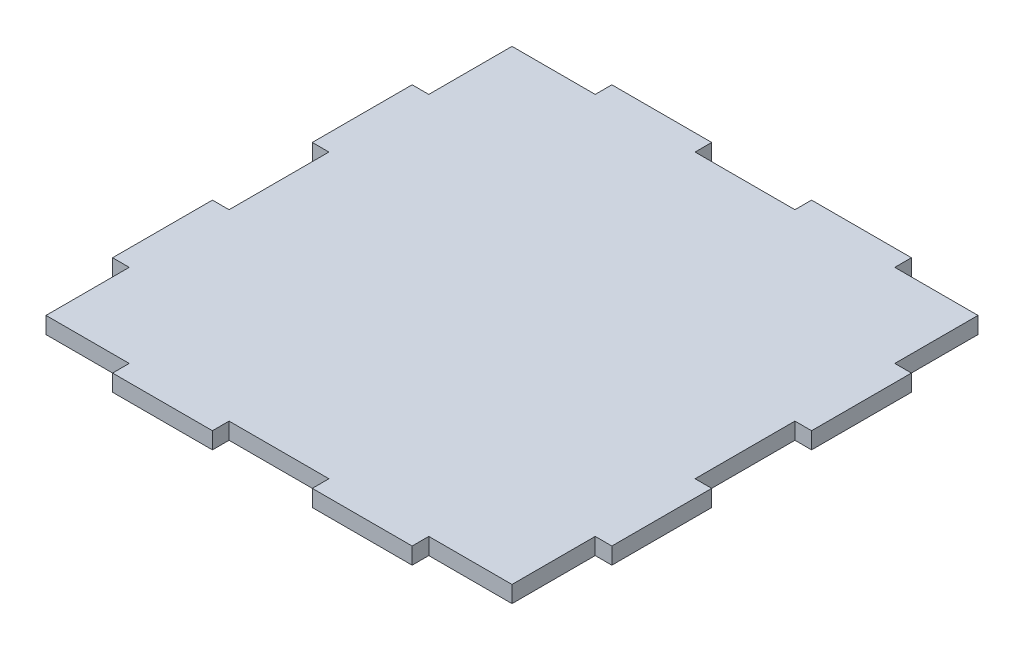
ISO-10303-21;
HEADER;
FILE_DESCRIPTION(('STEP AP214'),'2;1');
FILE_NAME('part.step','',(''),(''),'','','');
FILE_SCHEMA(('AUTOMOTIVE_DESIGN { 1 0 10303 214 1 1 1 1 }'));
ENDSEC;
DATA;
#1=APPLICATION_CONTEXT('core data for automotive mechanical design processes');
#2=APPLICATION_PROTOCOL_DEFINITION('international standard','automotive_design',2000,#1);
#3=PRODUCT_CONTEXT('',#1,'mechanical');
#4=PRODUCT('Part','Part','',(#3));
#5=PRODUCT_RELATED_PRODUCT_CATEGORY('part','',(#4));
#6=PRODUCT_DEFINITION_FORMATION('','',#4);
#7=PRODUCT_DEFINITION_CONTEXT('part definition',#1,'design');
#8=PRODUCT_DEFINITION('design','',#6,#7);
#9=PRODUCT_DEFINITION_SHAPE('','',#8);
#10=(LENGTH_UNIT() NAMED_UNIT(*) SI_UNIT(.MILLI.,.METRE.));
#11=(NAMED_UNIT(*) PLANE_ANGLE_UNIT() SI_UNIT($,.RADIAN.));
#12=(NAMED_UNIT(*) SI_UNIT($,.STERADIAN.) SOLID_ANGLE_UNIT());
#13=UNCERTAINTY_MEASURE_WITH_UNIT(LENGTH_MEASURE(1.E-05),#10,'distance_accuracy_value','');
#14=(GEOMETRIC_REPRESENTATION_CONTEXT(3) GLOBAL_UNCERTAINTY_ASSIGNED_CONTEXT((#13)) GLOBAL_UNIT_ASSIGNED_CONTEXT((#10,
#11,#12)) REPRESENTATION_CONTEXT('',''));
#15=CARTESIAN_POINT('',(0.,0.,0.));
#16=DIRECTION('',(0.,0.,1.));
#17=DIRECTION('',(1.,0.,0.));
#18=AXIS2_PLACEMENT_3D('',#15,#16,#17);
#19=CARTESIAN_POINT('',(-8.99999999999999,3.,0.));
#20=DIRECTION('',(1.,0.,0.));
#21=DIRECTION('',(0.,0.,-1.));
#22=AXIS2_PLACEMENT_3D('',#19,#20,#21);
#23=PLANE('',#22);
#24=DIRECTION('',(0.,0.,1.));
#25=VECTOR('',#24,1.);
#26=CARTESIAN_POINT('',(-8.99999999999999,0.,0.));
#27=LINE('',#26,#25);
#28=CARTESIAN_POINT('',(-8.99999999999999,0.,42.));
#29=VERTEX_POINT('',#28);
#30=CARTESIAN_POINT('',(-8.99999999999999,0.,45.));
#31=VERTEX_POINT('',#30);
#32=EDGE_CURVE('E296',#29,#31,#27,.T.);
#33=ORIENTED_EDGE('',*,*,#32,.F.);
#34=DIRECTION('',(0.,-1.,0.));
#35=VECTOR('',#34,1.);
#36=CARTESIAN_POINT('',(-8.99999999999999,3.,42.));
#37=LINE('',#36,#35);
#38=CARTESIAN_POINT('',(-8.99999999999999,3.,42.));
#39=VERTEX_POINT('',#38);
#40=EDGE_CURVE('E11',#39,#29,#37,.T.);
#41=ORIENTED_EDGE('',*,*,#40,.F.);
#42=DIRECTION('',(0.,0.,1.));
#43=VECTOR('',#42,1.);
#44=CARTESIAN_POINT('',(-8.99999999999999,3.,0.));
#45=LINE('',#44,#43);
#46=CARTESIAN_POINT('',(-8.99999999999999,3.,45.));
#47=VERTEX_POINT('',#46);
#48=EDGE_CURVE('E479',#39,#47,#45,.T.);
#49=ORIENTED_EDGE('',*,*,#48,.T.);
#50=DIRECTION('',(0.,-1.,0.));
#51=VECTOR('',#50,1.);
#52=CARTESIAN_POINT('',(-8.99999999999999,3.,45.));
#53=LINE('',#52,#51);
#54=EDGE_CURVE('E168',#47,#31,#53,.T.);
#55=ORIENTED_EDGE('',*,*,#54,.T.);
#56=EDGE_LOOP('',(#33,#41,#49,#55));
#57=FACE_BOUND('',#56,.T.);
#58=ADVANCED_FACE('F34',(#57),#23,.T.);
#59=CARTESIAN_POINT('',(0.,3.,42.));
#60=DIRECTION('',(0.,0.,1.));
#61=DIRECTION('',(1.,0.,0.));
#62=AXIS2_PLACEMENT_3D('',#59,#60,#61);
#63=PLANE('',#62);
#64=DIRECTION('',(-1.,0.,0.));
#65=VECTOR('',#64,1.);
#66=CARTESIAN_POINT('',(0.,0.,42.));
#67=LINE('',#66,#65);
#68=CARTESIAN_POINT('',(9.00000000000001,0.,42.));
#69=VERTEX_POINT('',#68);
#70=EDGE_CURVE('E299',#69,#29,#67,.T.);
#71=ORIENTED_EDGE('',*,*,#70,.F.);
#72=DIRECTION('',(0.,-1.,0.));
#73=VECTOR('',#72,1.);
#74=CARTESIAN_POINT('',(9.00000000000001,3.,42.));
#75=LINE('',#74,#73);
#76=CARTESIAN_POINT('',(9.00000000000001,3.,42.));
#77=VERTEX_POINT('',#76);
#78=EDGE_CURVE('E42',#77,#69,#75,.T.);
#79=ORIENTED_EDGE('',*,*,#78,.F.);
#80=DIRECTION('',(-1.,0.,0.));
#81=VECTOR('',#80,1.);
#82=CARTESIAN_POINT('',(0.,3.,42.));
#83=LINE('',#82,#81);
#84=EDGE_CURVE('E477',#77,#39,#83,.T.);
#85=ORIENTED_EDGE('',*,*,#84,.T.);
#86=ORIENTED_EDGE('',*,*,#40,.T.);
#87=EDGE_LOOP('',(#71,#79,#85,#86));
#88=FACE_BOUND('',#87,.T.);
#89=ADVANCED_FACE('F465',(#88),#63,.T.);
#90=CARTESIAN_POINT('',(9.00000000000001,3.,0.));
#91=DIRECTION('',(-1.,0.,0.));
#92=DIRECTION('',(0.,0.,1.));
#93=AXIS2_PLACEMENT_3D('',#90,#91,#92);
#94=PLANE('',#93);
#95=DIRECTION('',(0.,0.,-1.));
#96=VECTOR('',#95,1.);
#97=CARTESIAN_POINT('',(9.00000000000001,0.,0.));
#98=LINE('',#97,#96);
#99=CARTESIAN_POINT('',(9.00000000000001,0.,45.));
#100=VERTEX_POINT('',#99);
#101=EDGE_CURVE('E302',#100,#69,#98,.T.);
#102=ORIENTED_EDGE('',*,*,#101,.F.);
#103=DIRECTION('',(0.,-1.,0.));
#104=VECTOR('',#103,1.);
#105=CARTESIAN_POINT('',(9.00000000000001,3.,45.));
#106=LINE('',#105,#104);
#107=CARTESIAN_POINT('',(9.00000000000001,3.,45.));
#108=VERTEX_POINT('',#107);
#109=EDGE_CURVE('E454',#108,#100,#106,.T.);
#110=ORIENTED_EDGE('',*,*,#109,.F.);
#111=DIRECTION('',(0.,0.,-1.));
#112=VECTOR('',#111,1.);
#113=CARTESIAN_POINT('',(9.00000000000001,3.,0.));
#114=LINE('',#113,#112);
#115=EDGE_CURVE('E461',#108,#77,#114,.T.);
#116=ORIENTED_EDGE('',*,*,#115,.T.);
#117=ORIENTED_EDGE('',*,*,#78,.T.);
#118=EDGE_LOOP('',(#102,#110,#116,#117));
#119=FACE_BOUND('',#118,.T.);
#120=ADVANCED_FACE('F459',(#119),#94,.T.);
#121=CARTESIAN_POINT('',(0.,3.,45.));
#122=DIRECTION('',(0.,0.,-1.));
#123=DIRECTION('',(-1.,0.,0.));
#124=AXIS2_PLACEMENT_3D('',#121,#122,#123);
#125=PLANE('',#124);
#126=DIRECTION('',(1.,0.,0.));
#127=VECTOR('',#126,1.);
#128=CARTESIAN_POINT('',(0.,0.,45.));
#129=LINE('',#128,#127);
#130=CARTESIAN_POINT('',(27.,0.,45.));
#131=VERTEX_POINT('',#130);
#132=EDGE_CURVE('E305',#100,#131,#129,.T.);
#133=ORIENTED_EDGE('',*,*,#132,.T.);
#134=DIRECTION('',(0.,-1.,0.));
#135=VECTOR('',#134,1.);
#136=CARTESIAN_POINT('',(27.,3.,45.));
#137=LINE('',#136,#135);
#138=CARTESIAN_POINT('',(27.,3.,45.));
#139=VERTEX_POINT('',#138);
#140=EDGE_CURVE('E452',#139,#131,#137,.T.);
#141=ORIENTED_EDGE('',*,*,#140,.F.);
#142=DIRECTION('',(1.,0.,0.));
#143=VECTOR('',#142,1.);
#144=CARTESIAN_POINT('',(0.,3.,45.));
#145=LINE('',#144,#143);
#146=EDGE_CURVE('E293',#108,#139,#145,.T.);
#147=ORIENTED_EDGE('',*,*,#146,.F.);
#148=ORIENTED_EDGE('',*,*,#109,.T.);
#149=EDGE_LOOP('',(#133,#141,#147,#148));
#150=FACE_BOUND('',#149,.T.);
#151=ADVANCED_FACE('F472',(#150),#125,.F.);
#152=CARTESIAN_POINT('',(27.,3.,0.));
#153=DIRECTION('',(1.,0.,0.));
#154=DIRECTION('',(0.,0.,-1.));
#155=AXIS2_PLACEMENT_3D('',#152,#153,#154);
#156=PLANE('',#155);
#157=DIRECTION('',(0.,0.,1.));
#158=VECTOR('',#157,1.);
#159=CARTESIAN_POINT('',(27.,0.,0.));
#160=LINE('',#159,#158);
#161=CARTESIAN_POINT('',(27.,0.,42.));
#162=VERTEX_POINT('',#161);
#163=EDGE_CURVE('E308',#162,#131,#160,.T.);
#164=ORIENTED_EDGE('',*,*,#163,.F.);
#165=DIRECTION('',(0.,-1.,0.));
#166=VECTOR('',#165,1.);
#167=CARTESIAN_POINT('',(27.,3.,42.));
#168=LINE('',#167,#166);
#169=CARTESIAN_POINT('',(27.,3.,42.));
#170=VERTEX_POINT('',#169);
#171=EDGE_CURVE('E450',#170,#162,#168,.T.);
#172=ORIENTED_EDGE('',*,*,#171,.F.);
#173=DIRECTION('',(0.,0.,1.));
#174=VECTOR('',#173,1.);
#175=CARTESIAN_POINT('',(27.,3.,0.));
#176=LINE('',#175,#174);
#177=EDGE_CURVE('E476',#170,#139,#176,.T.);
#178=ORIENTED_EDGE('',*,*,#177,.T.);
#179=ORIENTED_EDGE('',*,*,#140,.T.);
#180=EDGE_LOOP('',(#164,#172,#178,#179));
#181=FACE_BOUND('',#180,.T.);
#182=ADVANCED_FACE('F570',(#181),#156,.T.);
#183=CARTESIAN_POINT('',(0.,3.,42.));
#184=DIRECTION('',(0.,0.,1.));
#185=DIRECTION('',(1.,0.,0.));
#186=AXIS2_PLACEMENT_3D('',#183,#184,#185);
#187=PLANE('',#186);
#188=DIRECTION('',(-1.,0.,0.));
#189=VECTOR('',#188,1.);
#190=CARTESIAN_POINT('',(0.,0.,42.));
#191=LINE('',#190,#189);
#192=CARTESIAN_POINT('',(42.,0.,42.));
#193=VERTEX_POINT('',#192);
#194=EDGE_CURVE('E312',#193,#162,#191,.T.);
#195=ORIENTED_EDGE('',*,*,#194,.F.);
#196=DIRECTION('',(0.,-1.,0.));
#197=VECTOR('',#196,1.);
#198=CARTESIAN_POINT('',(42.,3.,42.));
#199=LINE('',#198,#197);
#200=CARTESIAN_POINT('',(42.,3.,42.));
#201=VERTEX_POINT('',#200);
#202=EDGE_CURVE('E448',#201,#193,#199,.T.);
#203=ORIENTED_EDGE('',*,*,#202,.F.);
#204=DIRECTION('',(-1.,0.,0.));
#205=VECTOR('',#204,1.);
#206=CARTESIAN_POINT('',(0.,3.,42.));
#207=LINE('',#206,#205);
#208=EDGE_CURVE('E484',#201,#170,#207,.T.);
#209=ORIENTED_EDGE('',*,*,#208,.T.);
#210=ORIENTED_EDGE('',*,*,#171,.T.);
#211=EDGE_LOOP('',(#195,#203,#209,#210));
#212=FACE_BOUND('',#211,.T.);
#213=ADVANCED_FACE('F573',(#212),#187,.T.);
#214=CARTESIAN_POINT('',(42.,3.,0.));
#215=DIRECTION('',(1.,0.,0.));
#216=DIRECTION('',(0.,0.,-1.));
#217=AXIS2_PLACEMENT_3D('',#214,#215,#216);
#218=PLANE('',#217);
#219=DIRECTION('',(0.,0.,1.));
#220=VECTOR('',#219,1.);
#221=CARTESIAN_POINT('',(42.,0.,0.));
#222=LINE('',#221,#220);
#223=CARTESIAN_POINT('',(42.,0.,27.));
#224=VERTEX_POINT('',#223);
#225=EDGE_CURVE('E315',#224,#193,#222,.T.);
#226=ORIENTED_EDGE('',*,*,#225,.F.);
#227=DIRECTION('',(0.,-1.,0.));
#228=VECTOR('',#227,1.);
#229=CARTESIAN_POINT('',(42.,3.,27.));
#230=LINE('',#229,#228);
#231=CARTESIAN_POINT('',(42.,3.,27.));
#232=VERTEX_POINT('',#231);
#233=EDGE_CURVE('E446',#232,#224,#230,.T.);
#234=ORIENTED_EDGE('',*,*,#233,.F.);
#235=DIRECTION('',(0.,0.,1.));
#236=VECTOR('',#235,1.);
#237=CARTESIAN_POINT('',(42.,3.,0.));
#238=LINE('',#237,#236);
#239=EDGE_CURVE('E487',#232,#201,#238,.T.);
#240=ORIENTED_EDGE('',*,*,#239,.T.);
#241=ORIENTED_EDGE('',*,*,#202,.T.);
#242=EDGE_LOOP('',(#226,#234,#240,#241));
#243=FACE_BOUND('',#242,.T.);
#244=ADVANCED_FACE('F577',(#243),#218,.T.);
#245=CARTESIAN_POINT('',(0.,3.,27.));
#246=DIRECTION('',(0.,0.,1.));
#247=DIRECTION('',(1.,0.,0.));
#248=AXIS2_PLACEMENT_3D('',#245,#246,#247);
#249=PLANE('',#248);
#250=DIRECTION('',(-1.,0.,0.));
#251=VECTOR('',#250,1.);
#252=CARTESIAN_POINT('',(0.,0.,27.));
#253=LINE('',#252,#251);
#254=CARTESIAN_POINT('',(45.,0.,27.));
#255=VERTEX_POINT('',#254);
#256=EDGE_CURVE('E318',#255,#224,#253,.T.);
#257=ORIENTED_EDGE('',*,*,#256,.F.);
#258=DIRECTION('',(0.,-1.,0.));
#259=VECTOR('',#258,1.);
#260=CARTESIAN_POINT('',(45.,3.,27.));
#261=LINE('',#260,#259);
#262=CARTESIAN_POINT('',(45.,3.,27.));
#263=VERTEX_POINT('',#262);
#264=EDGE_CURVE('E444',#263,#255,#261,.T.);
#265=ORIENTED_EDGE('',*,*,#264,.F.);
#266=DIRECTION('',(-1.,0.,0.));
#267=VECTOR('',#266,1.);
#268=CARTESIAN_POINT('',(0.,3.,27.));
#269=LINE('',#268,#267);
#270=EDGE_CURVE('E490',#263,#232,#269,.T.);
#271=ORIENTED_EDGE('',*,*,#270,.T.);
#272=ORIENTED_EDGE('',*,*,#233,.T.);
#273=EDGE_LOOP('',(#257,#265,#271,#272));
#274=FACE_BOUND('',#273,.T.);
#275=ADVANCED_FACE('F581',(#274),#249,.T.);
#276=CARTESIAN_POINT('',(45.,3.,0.));
#277=DIRECTION('',(-1.,0.,0.));
#278=DIRECTION('',(0.,0.,1.));
#279=AXIS2_PLACEMENT_3D('',#276,#277,#278);
#280=PLANE('',#279);
#281=DIRECTION('',(0.,0.,-1.));
#282=VECTOR('',#281,1.);
#283=CARTESIAN_POINT('',(45.,0.,0.));
#284=LINE('',#283,#282);
#285=CARTESIAN_POINT('',(45.,0.,8.99999999999998));
#286=VERTEX_POINT('',#285);
#287=EDGE_CURVE('E321',#255,#286,#284,.T.);
#288=ORIENTED_EDGE('',*,*,#287,.T.);
#289=DIRECTION('',(0.,-1.,0.));
#290=VECTOR('',#289,1.);
#291=CARTESIAN_POINT('',(45.,3.,8.99999999999998));
#292=LINE('',#291,#290);
#293=CARTESIAN_POINT('',(45.,3.,8.99999999999998));
#294=VERTEX_POINT('',#293);
#295=EDGE_CURVE('E442',#294,#286,#292,.T.);
#296=ORIENTED_EDGE('',*,*,#295,.F.);
#297=DIRECTION('',(0.,0.,-1.));
#298=VECTOR('',#297,1.);
#299=CARTESIAN_POINT('',(45.,3.,0.));
#300=LINE('',#299,#298);
#301=EDGE_CURVE('E493',#263,#294,#300,.T.);
#302=ORIENTED_EDGE('',*,*,#301,.F.);
#303=ORIENTED_EDGE('',*,*,#264,.T.);
#304=EDGE_LOOP('',(#288,#296,#302,#303));
#305=FACE_BOUND('',#304,.T.);
#306=ADVANCED_FACE('F585',(#305),#280,.F.);
#307=CARTESIAN_POINT('',(0.,3.,8.99999999999998));
#308=DIRECTION('',(0.,0.,-1.));
#309=DIRECTION('',(-1.,0.,0.));
#310=AXIS2_PLACEMENT_3D('',#307,#308,#309);
#311=PLANE('',#310);
#312=DIRECTION('',(1.,0.,0.));
#313=VECTOR('',#312,1.);
#314=CARTESIAN_POINT('',(0.,0.,8.99999999999998));
#315=LINE('',#314,#313);
#316=CARTESIAN_POINT('',(42.,0.,8.99999999999998));
#317=VERTEX_POINT('',#316);
#318=EDGE_CURVE('E324',#317,#286,#315,.T.);
#319=ORIENTED_EDGE('',*,*,#318,.F.);
#320=DIRECTION('',(0.,-1.,0.));
#321=VECTOR('',#320,1.);
#322=CARTESIAN_POINT('',(42.,3.,8.99999999999998));
#323=LINE('',#322,#321);
#324=CARTESIAN_POINT('',(42.,3.,8.99999999999998));
#325=VERTEX_POINT('',#324);
#326=EDGE_CURVE('E440',#325,#317,#323,.T.);
#327=ORIENTED_EDGE('',*,*,#326,.F.);
#328=DIRECTION('',(1.,0.,0.));
#329=VECTOR('',#328,1.);
#330=CARTESIAN_POINT('',(0.,3.,8.99999999999998));
#331=LINE('',#330,#329);
#332=EDGE_CURVE('E495',#325,#294,#331,.T.);
#333=ORIENTED_EDGE('',*,*,#332,.T.);
#334=ORIENTED_EDGE('',*,*,#295,.T.);
#335=EDGE_LOOP('',(#319,#327,#333,#334));
#336=FACE_BOUND('',#335,.T.);
#337=ADVANCED_FACE('F587',(#336),#311,.T.);
#338=CARTESIAN_POINT('',(42.,3.,0.));
#339=DIRECTION('',(1.,0.,0.));
#340=DIRECTION('',(0.,0.,-1.));
#341=AXIS2_PLACEMENT_3D('',#338,#339,#340);
#342=PLANE('',#341);
#343=DIRECTION('',(0.,0.,1.));
#344=VECTOR('',#343,1.);
#345=CARTESIAN_POINT('',(42.,0.,0.));
#346=LINE('',#345,#344);
#347=CARTESIAN_POINT('',(42.,0.,-9.00000000000001));
#348=VERTEX_POINT('',#347);
#349=EDGE_CURVE('E328',#348,#317,#346,.T.);
#350=ORIENTED_EDGE('',*,*,#349,.F.);
#351=DIRECTION('',(0.,-1.,0.));
#352=VECTOR('',#351,1.);
#353=CARTESIAN_POINT('',(42.,3.,-9.00000000000001));
#354=LINE('',#353,#352);
#355=CARTESIAN_POINT('',(42.,3.,-9.00000000000001));
#356=VERTEX_POINT('',#355);
#357=EDGE_CURVE('E438',#356,#348,#354,.T.);
#358=ORIENTED_EDGE('',*,*,#357,.F.);
#359=DIRECTION('',(0.,0.,1.));
#360=VECTOR('',#359,1.);
#361=CARTESIAN_POINT('',(42.,3.,0.));
#362=LINE('',#361,#360);
#363=EDGE_CURVE('E499',#356,#325,#362,.T.);
#364=ORIENTED_EDGE('',*,*,#363,.T.);
#365=ORIENTED_EDGE('',*,*,#326,.T.);
#366=EDGE_LOOP('',(#350,#358,#364,#365));
#367=FACE_BOUND('',#366,.T.);
#368=ADVANCED_FACE('F590',(#367),#342,.T.);
#369=CARTESIAN_POINT('',(0.,3.,-8.99999999999997));
#370=DIRECTION('',(0.,0.,1.));
#371=DIRECTION('',(1.,0.,0.));
#372=AXIS2_PLACEMENT_3D('',#369,#370,#371);
#373=PLANE('',#372);
#374=DIRECTION('',(-1.,0.,0.));
#375=VECTOR('',#374,1.);
#376=CARTESIAN_POINT('',(0.,0.,-8.99999999999997));
#377=LINE('',#376,#375);
#378=CARTESIAN_POINT('',(45.,0.,-9.00000000000002));
#379=VERTEX_POINT('',#378);
#380=EDGE_CURVE('E331',#379,#348,#377,.T.);
#381=ORIENTED_EDGE('',*,*,#380,.F.);
#382=DIRECTION('',(0.,-1.,0.));
#383=VECTOR('',#382,1.);
#384=CARTESIAN_POINT('',(45.,3.,-9.00000000000002));
#385=LINE('',#384,#383);
#386=CARTESIAN_POINT('',(45.,3.,-9.00000000000002));
#387=VERTEX_POINT('',#386);
#388=EDGE_CURVE('E436',#387,#379,#385,.T.);
#389=ORIENTED_EDGE('',*,*,#388,.F.);
#390=DIRECTION('',(-1.,0.,0.));
#391=VECTOR('',#390,1.);
#392=CARTESIAN_POINT('',(0.,3.,-8.99999999999997));
#393=LINE('',#392,#391);
#394=EDGE_CURVE('E502',#387,#356,#393,.T.);
#395=ORIENTED_EDGE('',*,*,#394,.T.);
#396=ORIENTED_EDGE('',*,*,#357,.T.);
#397=EDGE_LOOP('',(#381,#389,#395,#396));
#398=FACE_BOUND('',#397,.T.);
#399=ADVANCED_FACE('F594',(#398),#373,.T.);
#400=CARTESIAN_POINT('',(45.,0.,-27.));
#401=VERTEX_POINT('',#400);
#402=EDGE_CURVE('E325',#379,#401,#284,.T.);
#403=ORIENTED_EDGE('',*,*,#402,.T.);
#404=DIRECTION('',(0.,-1.,0.));
#405=VECTOR('',#404,1.);
#406=CARTESIAN_POINT('',(45.,3.,-27.));
#407=LINE('',#406,#405);
#408=CARTESIAN_POINT('',(45.,3.,-27.));
#409=VERTEX_POINT('',#408);
#410=EDGE_CURVE('E434',#409,#401,#407,.T.);
#411=ORIENTED_EDGE('',*,*,#410,.F.);
#412=EDGE_CURVE('E496',#387,#409,#300,.T.);
#413=ORIENTED_EDGE('',*,*,#412,.F.);
#414=ORIENTED_EDGE('',*,*,#388,.T.);
#415=EDGE_LOOP('',(#403,#411,#413,#414));
#416=FACE_BOUND('',#415,.T.);
#417=ADVANCED_FACE('F598',(#416),#280,.F.);
#418=CARTESIAN_POINT('',(0.,3.,-27.));
#419=DIRECTION('',(0.,0.,-1.));
#420=DIRECTION('',(-1.,0.,0.));
#421=AXIS2_PLACEMENT_3D('',#418,#419,#420);
#422=PLANE('',#421);
#423=DIRECTION('',(1.,0.,0.));
#424=VECTOR('',#423,1.);
#425=CARTESIAN_POINT('',(0.,0.,-27.));
#426=LINE('',#425,#424);
#427=CARTESIAN_POINT('',(42.,0.,-27.));
#428=VERTEX_POINT('',#427);
#429=EDGE_CURVE('E334',#428,#401,#426,.T.);
#430=ORIENTED_EDGE('',*,*,#429,.F.);
#431=DIRECTION('',(0.,-1.,0.));
#432=VECTOR('',#431,1.);
#433=CARTESIAN_POINT('',(42.,3.,-27.));
#434=LINE('',#433,#432);
#435=CARTESIAN_POINT('',(42.,3.,-27.));
#436=VERTEX_POINT('',#435);
#437=EDGE_CURVE('E432',#436,#428,#434,.T.);
#438=ORIENTED_EDGE('',*,*,#437,.F.);
#439=DIRECTION('',(1.,0.,0.));
#440=VECTOR('',#439,1.);
#441=CARTESIAN_POINT('',(0.,3.,-27.));
#442=LINE('',#441,#440);
#443=EDGE_CURVE('E505',#436,#409,#442,.T.);
#444=ORIENTED_EDGE('',*,*,#443,.T.);
#445=ORIENTED_EDGE('',*,*,#410,.T.);
#446=EDGE_LOOP('',(#430,#438,#444,#445));
#447=FACE_BOUND('',#446,.T.);
#448=ADVANCED_FACE('F602',(#447),#422,.T.);
#449=CARTESIAN_POINT('',(42.,3.,0.));
#450=DIRECTION('',(1.,0.,0.));
#451=DIRECTION('',(0.,0.,-1.));
#452=AXIS2_PLACEMENT_3D('',#449,#450,#451);
#453=PLANE('',#452);
#454=DIRECTION('',(0.,0.,1.));
#455=VECTOR('',#454,1.);
#456=CARTESIAN_POINT('',(42.,0.,0.));
#457=LINE('',#456,#455);
#458=CARTESIAN_POINT('',(42.,0.,-42.));
#459=VERTEX_POINT('',#458);
#460=EDGE_CURVE('E337',#459,#428,#457,.T.);
#461=ORIENTED_EDGE('',*,*,#460,.F.);
#462=DIRECTION('',(0.,-1.,0.));
#463=VECTOR('',#462,1.);
#464=CARTESIAN_POINT('',(42.,3.,-42.));
#465=LINE('',#464,#463);
#466=CARTESIAN_POINT('',(42.,3.,-42.));
#467=VERTEX_POINT('',#466);
#468=EDGE_CURVE('E430',#467,#459,#465,.T.);
#469=ORIENTED_EDGE('',*,*,#468,.F.);
#470=DIRECTION('',(0.,0.,1.));
#471=VECTOR('',#470,1.);
#472=CARTESIAN_POINT('',(42.,3.,0.));
#473=LINE('',#472,#471);
#474=EDGE_CURVE('E508',#467,#436,#473,.T.);
#475=ORIENTED_EDGE('',*,*,#474,.T.);
#476=ORIENTED_EDGE('',*,*,#437,.T.);
#477=EDGE_LOOP('',(#461,#469,#475,#476));
#478=FACE_BOUND('',#477,.T.);
#479=ADVANCED_FACE('F606',(#478),#453,.T.);
#480=CARTESIAN_POINT('',(0.,3.,-42.));
#481=DIRECTION('',(0.,0.,-1.));
#482=DIRECTION('',(-1.,0.,0.));
#483=AXIS2_PLACEMENT_3D('',#480,#481,#482);
#484=PLANE('',#483);
#485=DIRECTION('',(1.,0.,0.));
#486=VECTOR('',#485,1.);
#487=CARTESIAN_POINT('',(0.,0.,-42.));
#488=LINE('',#487,#486);
#489=CARTESIAN_POINT('',(27.,0.,-42.));
#490=VERTEX_POINT('',#489);
#491=EDGE_CURVE('E340',#490,#459,#488,.T.);
#492=ORIENTED_EDGE('',*,*,#491,.F.);
#493=DIRECTION('',(0.,-1.,0.));
#494=VECTOR('',#493,1.);
#495=CARTESIAN_POINT('',(27.,3.,-42.));
#496=LINE('',#495,#494);
#497=CARTESIAN_POINT('',(27.,3.,-42.));
#498=VERTEX_POINT('',#497);
#499=EDGE_CURVE('E428',#498,#490,#496,.T.);
#500=ORIENTED_EDGE('',*,*,#499,.F.);
#501=DIRECTION('',(1.,0.,0.));
#502=VECTOR('',#501,1.);
#503=CARTESIAN_POINT('',(0.,3.,-42.));
#504=LINE('',#503,#502);
#505=EDGE_CURVE('E511',#498,#467,#504,.T.);
#506=ORIENTED_EDGE('',*,*,#505,.T.);
#507=ORIENTED_EDGE('',*,*,#468,.T.);
#508=EDGE_LOOP('',(#492,#500,#506,#507));
#509=FACE_BOUND('',#508,.T.);
#510=ADVANCED_FACE('F610',(#509),#484,.T.);
#511=CARTESIAN_POINT('',(27.,3.,0.));
#512=DIRECTION('',(1.,0.,0.));
#513=DIRECTION('',(0.,0.,-1.));
#514=AXIS2_PLACEMENT_3D('',#511,#512,#513);
#515=PLANE('',#514);
#516=DIRECTION('',(0.,0.,1.));
#517=VECTOR('',#516,1.);
#518=CARTESIAN_POINT('',(27.,0.,0.));
#519=LINE('',#518,#517);
#520=CARTESIAN_POINT('',(27.,0.,-45.));
#521=VERTEX_POINT('',#520);
#522=EDGE_CURVE('E343',#521,#490,#519,.T.);
#523=ORIENTED_EDGE('',*,*,#522,.F.);
#524=DIRECTION('',(0.,-1.,0.));
#525=VECTOR('',#524,1.);
#526=CARTESIAN_POINT('',(27.,3.,-45.));
#527=LINE('',#526,#525);
#528=CARTESIAN_POINT('',(27.,3.,-45.));
#529=VERTEX_POINT('',#528);
#530=EDGE_CURVE('E426',#529,#521,#527,.T.);
#531=ORIENTED_EDGE('',*,*,#530,.F.);
#532=DIRECTION('',(0.,0.,1.));
#533=VECTOR('',#532,1.);
#534=CARTESIAN_POINT('',(27.,3.,0.));
#535=LINE('',#534,#533);
#536=EDGE_CURVE('E514',#529,#498,#535,.T.);
#537=ORIENTED_EDGE('',*,*,#536,.T.);
#538=ORIENTED_EDGE('',*,*,#499,.T.);
#539=EDGE_LOOP('',(#523,#531,#537,#538));
#540=FACE_BOUND('',#539,.T.);
#541=ADVANCED_FACE('F614',(#540),#515,.T.);
#542=CARTESIAN_POINT('',(0.,3.,-45.));
#543=DIRECTION('',(0.,0.,-1.));
#544=DIRECTION('',(-1.,0.,0.));
#545=AXIS2_PLACEMENT_3D('',#542,#543,#544);
#546=PLANE('',#545);
#547=DIRECTION('',(1.,0.,0.));
#548=VECTOR('',#547,1.);
#549=CARTESIAN_POINT('',(0.,0.,-45.));
#550=LINE('',#549,#548);
#551=CARTESIAN_POINT('',(9.00000000000001,0.,-45.));
#552=VERTEX_POINT('',#551);
#553=EDGE_CURVE('E346',#552,#521,#550,.T.);
#554=ORIENTED_EDGE('',*,*,#553,.F.);
#555=DIRECTION('',(0.,-1.,0.));
#556=VECTOR('',#555,1.);
#557=CARTESIAN_POINT('',(9.00000000000001,3.,-45.));
#558=LINE('',#557,#556);
#559=CARTESIAN_POINT('',(9.00000000000001,3.,-45.));
#560=VERTEX_POINT('',#559);
#561=EDGE_CURVE('E424',#560,#552,#558,.T.);
#562=ORIENTED_EDGE('',*,*,#561,.F.);
#563=DIRECTION('',(1.,0.,0.));
#564=VECTOR('',#563,1.);
#565=CARTESIAN_POINT('',(0.,3.,-45.));
#566=LINE('',#565,#564);
#567=EDGE_CURVE('E517',#560,#529,#566,.T.);
#568=ORIENTED_EDGE('',*,*,#567,.T.);
#569=ORIENTED_EDGE('',*,*,#530,.T.);
#570=EDGE_LOOP('',(#554,#562,#568,#569));
#571=FACE_BOUND('',#570,.T.);
#572=ADVANCED_FACE('F618',(#571),#546,.T.);
#573=CARTESIAN_POINT('',(9.00000000000001,3.,0.));
#574=DIRECTION('',(-1.,0.,0.));
#575=DIRECTION('',(0.,0.,1.));
#576=AXIS2_PLACEMENT_3D('',#573,#574,#575);
#577=PLANE('',#576);
#578=DIRECTION('',(0.,0.,-1.));
#579=VECTOR('',#578,1.);
#580=CARTESIAN_POINT('',(9.00000000000001,0.,0.));
#581=LINE('',#580,#579);
#582=CARTESIAN_POINT('',(9.00000000000001,0.,-42.));
#583=VERTEX_POINT('',#582);
#584=EDGE_CURVE('E349',#583,#552,#581,.T.);
#585=ORIENTED_EDGE('',*,*,#584,.F.);
#586=DIRECTION('',(0.,-1.,0.));
#587=VECTOR('',#586,1.);
#588=CARTESIAN_POINT('',(9.00000000000001,3.,-42.));
#589=LINE('',#588,#587);
#590=CARTESIAN_POINT('',(9.00000000000001,3.,-42.));
#591=VERTEX_POINT('',#590);
#592=EDGE_CURVE('E422',#591,#583,#589,.T.);
#593=ORIENTED_EDGE('',*,*,#592,.F.);
#594=DIRECTION('',(0.,0.,-1.));
#595=VECTOR('',#594,1.);
#596=CARTESIAN_POINT('',(9.00000000000001,3.,0.));
#597=LINE('',#596,#595);
#598=EDGE_CURVE('E520',#591,#560,#597,.T.);
#599=ORIENTED_EDGE('',*,*,#598,.T.);
#600=ORIENTED_EDGE('',*,*,#561,.T.);
#601=EDGE_LOOP('',(#585,#593,#599,#600));
#602=FACE_BOUND('',#601,.T.);
#603=ADVANCED_FACE('F620',(#602),#577,.T.);
#604=CARTESIAN_POINT('',(0.,3.,-42.));
#605=DIRECTION('',(0.,0.,-1.));
#606=DIRECTION('',(-1.,0.,0.));
#607=AXIS2_PLACEMENT_3D('',#604,#605,#606);
#608=PLANE('',#607);
#609=DIRECTION('',(1.,0.,0.));
#610=VECTOR('',#609,1.);
#611=CARTESIAN_POINT('',(0.,0.,-42.));
#612=LINE('',#611,#610);
#613=CARTESIAN_POINT('',(-8.99999999999999,0.,-42.));
#614=VERTEX_POINT('',#613);
#615=EDGE_CURVE('E353',#614,#583,#612,.T.);
#616=ORIENTED_EDGE('',*,*,#615,.F.);
#617=DIRECTION('',(0.,-1.,0.));
#618=VECTOR('',#617,1.);
#619=CARTESIAN_POINT('',(-8.99999999999999,3.,-42.));
#620=LINE('',#619,#618);
#621=CARTESIAN_POINT('',(-8.99999999999999,3.,-42.));
#622=VERTEX_POINT('',#621);
#623=EDGE_CURVE('E420',#622,#614,#620,.T.);
#624=ORIENTED_EDGE('',*,*,#623,.F.);
#625=DIRECTION('',(1.,0.,0.));
#626=VECTOR('',#625,1.);
#627=CARTESIAN_POINT('',(0.,3.,-42.));
#628=LINE('',#627,#626);
#629=EDGE_CURVE('E524',#622,#591,#628,.T.);
#630=ORIENTED_EDGE('',*,*,#629,.T.);
#631=ORIENTED_EDGE('',*,*,#592,.T.);
#632=EDGE_LOOP('',(#616,#624,#630,#631));
#633=FACE_BOUND('',#632,.T.);
#634=ADVANCED_FACE('F623',(#633),#608,.T.);
#635=CARTESIAN_POINT('',(-8.99999999999999,3.,0.));
#636=DIRECTION('',(1.,0.,0.));
#637=DIRECTION('',(0.,0.,-1.));
#638=AXIS2_PLACEMENT_3D('',#635,#636,#637);
#639=PLANE('',#638);
#640=DIRECTION('',(0.,0.,1.));
#641=VECTOR('',#640,1.);
#642=CARTESIAN_POINT('',(-8.99999999999999,0.,0.));
#643=LINE('',#642,#641);
#644=CARTESIAN_POINT('',(-8.99999999999999,0.,-45.));
#645=VERTEX_POINT('',#644);
#646=EDGE_CURVE('E356',#645,#614,#643,.T.);
#647=ORIENTED_EDGE('',*,*,#646,.F.);
#648=DIRECTION('',(0.,-1.,0.));
#649=VECTOR('',#648,1.);
#650=CARTESIAN_POINT('',(-8.99999999999999,3.,-45.));
#651=LINE('',#650,#649);
#652=CARTESIAN_POINT('',(-8.99999999999999,3.,-45.));
#653=VERTEX_POINT('',#652);
#654=EDGE_CURVE('E418',#653,#645,#651,.T.);
#655=ORIENTED_EDGE('',*,*,#654,.F.);
#656=DIRECTION('',(0.,0.,1.));
#657=VECTOR('',#656,1.);
#658=CARTESIAN_POINT('',(-8.99999999999999,3.,0.));
#659=LINE('',#658,#657);
#660=EDGE_CURVE('E527',#653,#622,#659,.T.);
#661=ORIENTED_EDGE('',*,*,#660,.T.);
#662=ORIENTED_EDGE('',*,*,#623,.T.);
#663=EDGE_LOOP('',(#647,#655,#661,#662));
#664=FACE_BOUND('',#663,.T.);
#665=ADVANCED_FACE('F627',(#664),#639,.T.);
#666=CARTESIAN_POINT('',(-27.,0.,-45.));
#667=VERTEX_POINT('',#666);
#668=EDGE_CURVE('E350',#667,#645,#550,.T.);
#669=ORIENTED_EDGE('',*,*,#668,.F.);
#670=DIRECTION('',(0.,-1.,0.));
#671=VECTOR('',#670,1.);
#672=CARTESIAN_POINT('',(-27.,3.,-45.));
#673=LINE('',#672,#671);
#674=CARTESIAN_POINT('',(-27.,3.,-45.));
#675=VERTEX_POINT('',#674);
#676=EDGE_CURVE('E416',#675,#667,#673,.T.);
#677=ORIENTED_EDGE('',*,*,#676,.F.);
#678=EDGE_CURVE('E521',#675,#653,#566,.T.);
#679=ORIENTED_EDGE('',*,*,#678,.T.);
#680=ORIENTED_EDGE('',*,*,#654,.T.);
#681=EDGE_LOOP('',(#669,#677,#679,#680));
#682=FACE_BOUND('',#681,.T.);
#683=ADVANCED_FACE('F631',(#682),#546,.T.);
#684=CARTESIAN_POINT('',(-27.,3.,0.));
#685=DIRECTION('',(-1.,0.,0.));
#686=DIRECTION('',(0.,0.,1.));
#687=AXIS2_PLACEMENT_3D('',#684,#685,#686);
#688=PLANE('',#687);
#689=DIRECTION('',(0.,0.,-1.));
#690=VECTOR('',#689,1.);
#691=CARTESIAN_POINT('',(-27.,0.,0.));
#692=LINE('',#691,#690);
#693=CARTESIAN_POINT('',(-27.,0.,-42.));
#694=VERTEX_POINT('',#693);
#695=EDGE_CURVE('E359',#694,#667,#692,.T.);
#696=ORIENTED_EDGE('',*,*,#695,.F.);
#697=DIRECTION('',(0.,-1.,0.));
#698=VECTOR('',#697,1.);
#699=CARTESIAN_POINT('',(-27.,3.,-42.));
#700=LINE('',#699,#698);
#701=CARTESIAN_POINT('',(-27.,3.,-42.));
#702=VERTEX_POINT('',#701);
#703=EDGE_CURVE('E414',#702,#694,#700,.T.);
#704=ORIENTED_EDGE('',*,*,#703,.F.);
#705=DIRECTION('',(0.,0.,-1.));
#706=VECTOR('',#705,1.);
#707=CARTESIAN_POINT('',(-27.,3.,0.));
#708=LINE('',#707,#706);
#709=EDGE_CURVE('E530',#702,#675,#708,.T.);
#710=ORIENTED_EDGE('',*,*,#709,.T.);
#711=ORIENTED_EDGE('',*,*,#676,.T.);
#712=EDGE_LOOP('',(#696,#704,#710,#711));
#713=FACE_BOUND('',#712,.T.);
#714=ADVANCED_FACE('F635',(#713),#688,.T.);
#715=CARTESIAN_POINT('',(0.,3.,-42.));
#716=DIRECTION('',(0.,0.,-1.));
#717=DIRECTION('',(-1.,0.,0.));
#718=AXIS2_PLACEMENT_3D('',#715,#716,#717);
#719=PLANE('',#718);
#720=DIRECTION('',(1.,0.,0.));
#721=VECTOR('',#720,1.);
#722=CARTESIAN_POINT('',(0.,0.,-42.));
#723=LINE('',#722,#721);
#724=CARTESIAN_POINT('',(-42.,0.,-42.));
#725=VERTEX_POINT('',#724);
#726=EDGE_CURVE('E362',#725,#694,#723,.T.);
#727=ORIENTED_EDGE('',*,*,#726,.F.);
#728=DIRECTION('',(0.,-1.,0.));
#729=VECTOR('',#728,1.);
#730=CARTESIAN_POINT('',(-42.,3.,-42.));
#731=LINE('',#730,#729);
#732=CARTESIAN_POINT('',(-42.,3.,-42.));
#733=VERTEX_POINT('',#732);
#734=EDGE_CURVE('E412',#733,#725,#731,.T.);
#735=ORIENTED_EDGE('',*,*,#734,.F.);
#736=DIRECTION('',(1.,0.,0.));
#737=VECTOR('',#736,1.);
#738=CARTESIAN_POINT('',(0.,3.,-42.));
#739=LINE('',#738,#737);
#740=EDGE_CURVE('E533',#733,#702,#739,.T.);
#741=ORIENTED_EDGE('',*,*,#740,.T.);
#742=ORIENTED_EDGE('',*,*,#703,.T.);
#743=EDGE_LOOP('',(#727,#735,#741,#742));
#744=FACE_BOUND('',#743,.T.);
#745=ADVANCED_FACE('F639',(#744),#719,.T.);
#746=CARTESIAN_POINT('',(-42.,3.,0.));
#747=DIRECTION('',(-1.,0.,0.));
#748=DIRECTION('',(0.,0.,1.));
#749=AXIS2_PLACEMENT_3D('',#746,#747,#748);
#750=PLANE('',#749);
#751=DIRECTION('',(0.,0.,-1.));
#752=VECTOR('',#751,1.);
#753=CARTESIAN_POINT('',(-42.,0.,0.));
#754=LINE('',#753,#752);
#755=CARTESIAN_POINT('',(-42.,0.,-27.));
#756=VERTEX_POINT('',#755);
#757=EDGE_CURVE('E365',#756,#725,#754,.T.);
#758=ORIENTED_EDGE('',*,*,#757,.F.);
#759=DIRECTION('',(0.,-1.,0.));
#760=VECTOR('',#759,1.);
#761=CARTESIAN_POINT('',(-42.,3.,-27.));
#762=LINE('',#761,#760);
#763=CARTESIAN_POINT('',(-42.,3.,-27.));
#764=VERTEX_POINT('',#763);
#765=EDGE_CURVE('E410',#764,#756,#762,.T.);
#766=ORIENTED_EDGE('',*,*,#765,.F.);
#767=DIRECTION('',(0.,0.,-1.));
#768=VECTOR('',#767,1.);
#769=CARTESIAN_POINT('',(-42.,3.,0.));
#770=LINE('',#769,#768);
#771=EDGE_CURVE('E536',#764,#733,#770,.T.);
#772=ORIENTED_EDGE('',*,*,#771,.T.);
#773=ORIENTED_EDGE('',*,*,#734,.T.);
#774=EDGE_LOOP('',(#758,#766,#772,#773));
#775=FACE_BOUND('',#774,.T.);
#776=ADVANCED_FACE('F643',(#775),#750,.T.);
#777=CARTESIAN_POINT('',(0.,3.,-27.));
#778=DIRECTION('',(0.,0.,-1.));
#779=DIRECTION('',(-1.,0.,0.));
#780=AXIS2_PLACEMENT_3D('',#777,#778,#779);
#781=PLANE('',#780);
#782=DIRECTION('',(1.,0.,0.));
#783=VECTOR('',#782,1.);
#784=CARTESIAN_POINT('',(0.,0.,-27.));
#785=LINE('',#784,#783);
#786=CARTESIAN_POINT('',(-45.,0.,-27.));
#787=VERTEX_POINT('',#786);
#788=EDGE_CURVE('E368',#787,#756,#785,.T.);
#789=ORIENTED_EDGE('',*,*,#788,.F.);
#790=DIRECTION('',(0.,-1.,0.));
#791=VECTOR('',#790,1.);
#792=CARTESIAN_POINT('',(-45.,3.,-27.));
#793=LINE('',#792,#791);
#794=CARTESIAN_POINT('',(-45.,3.,-27.));
#795=VERTEX_POINT('',#794);
#796=EDGE_CURVE('E408',#795,#787,#793,.T.);
#797=ORIENTED_EDGE('',*,*,#796,.F.);
#798=DIRECTION('',(1.,0.,0.));
#799=VECTOR('',#798,1.);
#800=CARTESIAN_POINT('',(0.,3.,-27.));
#801=LINE('',#800,#799);
#802=EDGE_CURVE('E539',#795,#764,#801,.T.);
#803=ORIENTED_EDGE('',*,*,#802,.T.);
#804=ORIENTED_EDGE('',*,*,#765,.T.);
#805=EDGE_LOOP('',(#789,#797,#803,#804));
#806=FACE_BOUND('',#805,.T.);
#807=ADVANCED_FACE('F647',(#806),#781,.T.);
#808=CARTESIAN_POINT('',(-45.,3.,0.));
#809=DIRECTION('',(-1.,0.,0.));
#810=DIRECTION('',(0.,0.,1.));
#811=AXIS2_PLACEMENT_3D('',#808,#809,#810);
#812=PLANE('',#811);
#813=DIRECTION('',(0.,0.,-1.));
#814=VECTOR('',#813,1.);
#815=CARTESIAN_POINT('',(-45.,0.,0.));
#816=LINE('',#815,#814);
#817=CARTESIAN_POINT('',(-45.,0.,-9.00000000000001));
#818=VERTEX_POINT('',#817);
#819=EDGE_CURVE('E371',#818,#787,#816,.T.);
#820=ORIENTED_EDGE('',*,*,#819,.F.);
#821=DIRECTION('',(0.,-1.,0.));
#822=VECTOR('',#821,1.);
#823=CARTESIAN_POINT('',(-45.,3.,-9.00000000000001));
#824=LINE('',#823,#822);
#825=CARTESIAN_POINT('',(-45.,3.,-9.00000000000001));
#826=VERTEX_POINT('',#825);
#827=EDGE_CURVE('E406',#826,#818,#824,.T.);
#828=ORIENTED_EDGE('',*,*,#827,.F.);
#829=DIRECTION('',(0.,0.,-1.));
#830=VECTOR('',#829,1.);
#831=CARTESIAN_POINT('',(-45.,3.,0.));
#832=LINE('',#831,#830);
#833=EDGE_CURVE('E542',#826,#795,#832,.T.);
#834=ORIENTED_EDGE('',*,*,#833,.T.);
#835=ORIENTED_EDGE('',*,*,#796,.T.);
#836=EDGE_LOOP('',(#820,#828,#834,#835));
#837=FACE_BOUND('',#836,.T.);
#838=ADVANCED_FACE('F651',(#837),#812,.T.);
#839=CARTESIAN_POINT('',(0.,3.,-9.00000000000001));
#840=DIRECTION('',(0.,0.,1.));
#841=DIRECTION('',(1.,0.,0.));
#842=AXIS2_PLACEMENT_3D('',#839,#840,#841);
#843=PLANE('',#842);
#844=DIRECTION('',(-1.,0.,0.));
#845=VECTOR('',#844,1.);
#846=CARTESIAN_POINT('',(0.,0.,-9.00000000000001));
#847=LINE('',#846,#845);
#848=CARTESIAN_POINT('',(-42.,0.,-9.00000000000001));
#849=VERTEX_POINT('',#848);
#850=EDGE_CURVE('E374',#849,#818,#847,.T.);
#851=ORIENTED_EDGE('',*,*,#850,.F.);
#852=DIRECTION('',(0.,-1.,0.));
#853=VECTOR('',#852,1.);
#854=CARTESIAN_POINT('',(-42.,3.,-9.00000000000001));
#855=LINE('',#854,#853);
#856=CARTESIAN_POINT('',(-42.,3.,-9.00000000000001));
#857=VERTEX_POINT('',#856);
#858=EDGE_CURVE('E404',#857,#849,#855,.T.);
#859=ORIENTED_EDGE('',*,*,#858,.F.);
#860=DIRECTION('',(-1.,0.,0.));
#861=VECTOR('',#860,1.);
#862=CARTESIAN_POINT('',(0.,3.,-9.00000000000001));
#863=LINE('',#862,#861);
#864=EDGE_CURVE('E545',#857,#826,#863,.T.);
#865=ORIENTED_EDGE('',*,*,#864,.T.);
#866=ORIENTED_EDGE('',*,*,#827,.T.);
#867=EDGE_LOOP('',(#851,#859,#865,#866));
#868=FACE_BOUND('',#867,.T.);
#869=ADVANCED_FACE('F653',(#868),#843,.T.);
#870=CARTESIAN_POINT('',(-42.,3.,0.));
#871=DIRECTION('',(-1.,0.,0.));
#872=DIRECTION('',(0.,0.,1.));
#873=AXIS2_PLACEMENT_3D('',#870,#871,#872);
#874=PLANE('',#873);
#875=DIRECTION('',(0.,0.,-1.));
#876=VECTOR('',#875,1.);
#877=CARTESIAN_POINT('',(-42.,0.,0.));
#878=LINE('',#877,#876);
#879=CARTESIAN_POINT('',(-42.,0.,8.99999999999999));
#880=VERTEX_POINT('',#879);
#881=EDGE_CURVE('E378',#880,#849,#878,.T.);
#882=ORIENTED_EDGE('',*,*,#881,.F.);
#883=DIRECTION('',(0.,-1.,0.));
#884=VECTOR('',#883,1.);
#885=CARTESIAN_POINT('',(-42.,3.,8.99999999999999));
#886=LINE('',#885,#884);
#887=CARTESIAN_POINT('',(-42.,3.,8.99999999999999));
#888=VERTEX_POINT('',#887);
#889=EDGE_CURVE('E402',#888,#880,#886,.T.);
#890=ORIENTED_EDGE('',*,*,#889,.F.);
#891=DIRECTION('',(0.,0.,-1.));
#892=VECTOR('',#891,1.);
#893=CARTESIAN_POINT('',(-42.,3.,0.));
#894=LINE('',#893,#892);
#895=EDGE_CURVE('E549',#888,#857,#894,.T.);
#896=ORIENTED_EDGE('',*,*,#895,.T.);
#897=ORIENTED_EDGE('',*,*,#858,.T.);
#898=EDGE_LOOP('',(#882,#890,#896,#897));
#899=FACE_BOUND('',#898,.T.);
#900=ADVANCED_FACE('F656',(#899),#874,.T.);
#901=CARTESIAN_POINT('',(0.,3.,8.99999999999999));
#902=DIRECTION('',(0.,0.,-1.));
#903=DIRECTION('',(-1.,0.,0.));
#904=AXIS2_PLACEMENT_3D('',#901,#902,#903);
#905=PLANE('',#904);
#906=DIRECTION('',(1.,0.,0.));
#907=VECTOR('',#906,1.);
#908=CARTESIAN_POINT('',(0.,0.,8.99999999999999));
#909=LINE('',#908,#907);
#910=CARTESIAN_POINT('',(-45.,0.,8.99999999999999));
#911=VERTEX_POINT('',#910);
#912=EDGE_CURVE('E381',#911,#880,#909,.T.);
#913=ORIENTED_EDGE('',*,*,#912,.F.);
#914=DIRECTION('',(0.,-1.,0.));
#915=VECTOR('',#914,1.);
#916=CARTESIAN_POINT('',(-45.,3.,8.99999999999999));
#917=LINE('',#916,#915);
#918=CARTESIAN_POINT('',(-45.,3.,8.99999999999999));
#919=VERTEX_POINT('',#918);
#920=EDGE_CURVE('E400',#919,#911,#917,.T.);
#921=ORIENTED_EDGE('',*,*,#920,.F.);
#922=DIRECTION('',(1.,0.,0.));
#923=VECTOR('',#922,1.);
#924=CARTESIAN_POINT('',(0.,3.,8.99999999999999));
#925=LINE('',#924,#923);
#926=EDGE_CURVE('E552',#919,#888,#925,.T.);
#927=ORIENTED_EDGE('',*,*,#926,.T.);
#928=ORIENTED_EDGE('',*,*,#889,.T.);
#929=EDGE_LOOP('',(#913,#921,#927,#928));
#930=FACE_BOUND('',#929,.T.);
#931=ADVANCED_FACE('F660',(#930),#905,.T.);
#932=CARTESIAN_POINT('',(-45.,0.,27.));
#933=VERTEX_POINT('',#932);
#934=EDGE_CURVE('E375',#933,#911,#816,.T.);
#935=ORIENTED_EDGE('',*,*,#934,.F.);
#936=DIRECTION('',(0.,-1.,0.));
#937=VECTOR('',#936,1.);
#938=CARTESIAN_POINT('',(-45.,3.,27.));
#939=LINE('',#938,#937);
#940=CARTESIAN_POINT('',(-45.,3.,27.));
#941=VERTEX_POINT('',#940);
#942=EDGE_CURVE('E398',#941,#933,#939,.T.);
#943=ORIENTED_EDGE('',*,*,#942,.F.);
#944=EDGE_CURVE('E546',#941,#919,#832,.T.);
#945=ORIENTED_EDGE('',*,*,#944,.T.);
#946=ORIENTED_EDGE('',*,*,#920,.T.);
#947=EDGE_LOOP('',(#935,#943,#945,#946));
#948=FACE_BOUND('',#947,.T.);
#949=ADVANCED_FACE('F664',(#948),#812,.T.);
#950=CARTESIAN_POINT('',(0.,3.,27.));
#951=DIRECTION('',(0.,0.,1.));
#952=DIRECTION('',(1.,0.,0.));
#953=AXIS2_PLACEMENT_3D('',#950,#951,#952);
#954=PLANE('',#953);
#955=DIRECTION('',(-1.,0.,0.));
#956=VECTOR('',#955,1.);
#957=CARTESIAN_POINT('',(0.,0.,27.));
#958=LINE('',#957,#956);
#959=CARTESIAN_POINT('',(-42.,0.,27.));
#960=VERTEX_POINT('',#959);
#961=EDGE_CURVE('E384',#960,#933,#958,.T.);
#962=ORIENTED_EDGE('',*,*,#961,.F.);
#963=DIRECTION('',(0.,-1.,0.));
#964=VECTOR('',#963,1.);
#965=CARTESIAN_POINT('',(-42.,3.,27.));
#966=LINE('',#965,#964);
#967=CARTESIAN_POINT('',(-42.,3.,27.));
#968=VERTEX_POINT('',#967);
#969=EDGE_CURVE('E396',#968,#960,#966,.T.);
#970=ORIENTED_EDGE('',*,*,#969,.F.);
#971=DIRECTION('',(-1.,0.,0.));
#972=VECTOR('',#971,1.);
#973=CARTESIAN_POINT('',(0.,3.,27.));
#974=LINE('',#973,#972);
#975=EDGE_CURVE('E555',#968,#941,#974,.T.);
#976=ORIENTED_EDGE('',*,*,#975,.T.);
#977=ORIENTED_EDGE('',*,*,#942,.T.);
#978=EDGE_LOOP('',(#962,#970,#976,#977));
#979=FACE_BOUND('',#978,.T.);
#980=ADVANCED_FACE('F668',(#979),#954,.T.);
#981=CARTESIAN_POINT('',(-42.,3.,0.));
#982=DIRECTION('',(-1.,0.,0.));
#983=DIRECTION('',(0.,0.,1.));
#984=AXIS2_PLACEMENT_3D('',#981,#982,#983);
#985=PLANE('',#984);
#986=DIRECTION('',(0.,0.,-1.));
#987=VECTOR('',#986,1.);
#988=CARTESIAN_POINT('',(-42.,0.,0.));
#989=LINE('',#988,#987);
#990=CARTESIAN_POINT('',(-42.,0.,42.));
#991=VERTEX_POINT('',#990);
#992=EDGE_CURVE('E387',#991,#960,#989,.T.);
#993=ORIENTED_EDGE('',*,*,#992,.F.);
#994=DIRECTION('',(0.,-1.,0.));
#995=VECTOR('',#994,1.);
#996=CARTESIAN_POINT('',(-42.,3.,42.));
#997=LINE('',#996,#995);
#998=CARTESIAN_POINT('',(-42.,3.,42.));
#999=VERTEX_POINT('',#998);
#1000=EDGE_CURVE('E281',#999,#991,#997,.T.);
#1001=ORIENTED_EDGE('',*,*,#1000,.F.);
#1002=DIRECTION('',(0.,0.,-1.));
#1003=VECTOR('',#1002,1.);
#1004=CARTESIAN_POINT('',(-42.,3.,0.));
#1005=LINE('',#1004,#1003);
#1006=EDGE_CURVE('E288',#999,#968,#1005,.T.);
#1007=ORIENTED_EDGE('',*,*,#1006,.T.);
#1008=ORIENTED_EDGE('',*,*,#969,.T.);
#1009=EDGE_LOOP('',(#993,#1001,#1007,#1008));
#1010=FACE_BOUND('',#1009,.T.);
#1011=ADVANCED_FACE('F559',(#1010),#985,.T.);
#1012=CARTESIAN_POINT('',(0.,3.,42.));
#1013=DIRECTION('',(0.,0.,1.));
#1014=DIRECTION('',(1.,0.,0.));
#1015=AXIS2_PLACEMENT_3D('',#1012,#1013,#1014);
#1016=PLANE('',#1015);
#1017=DIRECTION('',(-1.,0.,0.));
#1018=VECTOR('',#1017,1.);
#1019=CARTESIAN_POINT('',(0.,0.,42.));
#1020=LINE('',#1019,#1018);
#1021=CARTESIAN_POINT('',(-27.,0.,42.));
#1022=VERTEX_POINT('',#1021);
#1023=EDGE_CURVE('E276',#1022,#991,#1020,.T.);
#1024=ORIENTED_EDGE('',*,*,#1023,.F.);
#1025=DIRECTION('',(0.,-1.,0.));
#1026=VECTOR('',#1025,1.);
#1027=CARTESIAN_POINT('',(-27.,3.,42.));
#1028=LINE('',#1027,#1026);
#1029=CARTESIAN_POINT('',(-27.,3.,42.));
#1030=VERTEX_POINT('',#1029);
#1031=EDGE_CURVE('E271',#1030,#1022,#1028,.T.);
#1032=ORIENTED_EDGE('',*,*,#1031,.F.);
#1033=DIRECTION('',(-1.,0.,0.));
#1034=VECTOR('',#1033,1.);
#1035=CARTESIAN_POINT('',(0.,3.,42.));
#1036=LINE('',#1035,#1034);
#1037=EDGE_CURVE('E274',#1030,#999,#1036,.T.);
#1038=ORIENTED_EDGE('',*,*,#1037,.T.);
#1039=ORIENTED_EDGE('',*,*,#1000,.T.);
#1040=EDGE_LOOP('',(#1024,#1032,#1038,#1039));
#1041=FACE_BOUND('',#1040,.T.);
#1042=ADVANCED_FACE('F273',(#1041),#1016,.T.);
#1043=CARTESIAN_POINT('',(-27.,3.,0.));
#1044=DIRECTION('',(-1.,0.,0.));
#1045=DIRECTION('',(0.,0.,1.));
#1046=AXIS2_PLACEMENT_3D('',#1043,#1044,#1045);
#1047=PLANE('',#1046);
#1048=DIRECTION('',(0.,0.,-1.));
#1049=VECTOR('',#1048,1.);
#1050=CARTESIAN_POINT('',(-27.,0.,0.));
#1051=LINE('',#1050,#1049);
#1052=CARTESIAN_POINT('',(-27.,0.,45.));
#1053=VERTEX_POINT('',#1052);
#1054=EDGE_CURVE('E391',#1053,#1022,#1051,.T.);
#1055=ORIENTED_EDGE('',*,*,#1054,.F.);
#1056=DIRECTION('',(0.,-1.,0.));
#1057=VECTOR('',#1056,1.);
#1058=CARTESIAN_POINT('',(-27.,3.,45.));
#1059=LINE('',#1058,#1057);
#1060=CARTESIAN_POINT('',(-27.,3.,45.));
#1061=VERTEX_POINT('',#1060);
#1062=EDGE_CURVE('E161',#1061,#1053,#1059,.T.);
#1063=ORIENTED_EDGE('',*,*,#1062,.F.);
#1064=DIRECTION('',(0.,0.,-1.));
#1065=VECTOR('',#1064,1.);
#1066=CARTESIAN_POINT('',(-27.,3.,0.));
#1067=LINE('',#1066,#1065);
#1068=EDGE_CURVE('E285',#1061,#1030,#1067,.T.);
#1069=ORIENTED_EDGE('',*,*,#1068,.T.);
#1070=ORIENTED_EDGE('',*,*,#1031,.T.);
#1071=EDGE_LOOP('',(#1055,#1063,#1069,#1070));
#1072=FACE_BOUND('',#1071,.T.);
#1073=ADVANCED_FACE('F290',(#1072),#1047,.T.);
#1074=EDGE_CURVE('E309',#1053,#31,#129,.T.);
#1075=ORIENTED_EDGE('',*,*,#1074,.T.);
#1076=ORIENTED_EDGE('',*,*,#54,.F.);
#1077=EDGE_CURVE('E50',#1061,#47,#145,.T.);
#1078=ORIENTED_EDGE('',*,*,#1077,.F.);
#1079=ORIENTED_EDGE('',*,*,#1062,.T.);
#1080=EDGE_LOOP('',(#1075,#1076,#1078,#1079));
#1081=FACE_BOUND('',#1080,.T.);
#1082=ADVANCED_FACE('F679',(#1081),#125,.F.);
#1083=CARTESIAN_POINT('',(0.,3.,0.));
#1084=DIRECTION('',(0.,1.,0.));
#1085=DIRECTION('',(0.,0.,1.));
#1086=AXIS2_PLACEMENT_3D('',#1083,#1084,#1085);
#1087=PLANE('',#1086);
#1088=ORIENTED_EDGE('',*,*,#48,.F.);
#1089=ORIENTED_EDGE('',*,*,#84,.F.);
#1090=ORIENTED_EDGE('',*,*,#115,.F.);
#1091=ORIENTED_EDGE('',*,*,#146,.T.);
#1092=ORIENTED_EDGE('',*,*,#177,.F.);
#1093=ORIENTED_EDGE('',*,*,#208,.F.);
#1094=ORIENTED_EDGE('',*,*,#239,.F.);
#1095=ORIENTED_EDGE('',*,*,#270,.F.);
#1096=ORIENTED_EDGE('',*,*,#301,.T.);
#1097=ORIENTED_EDGE('',*,*,#332,.F.);
#1098=ORIENTED_EDGE('',*,*,#363,.F.);
#1099=ORIENTED_EDGE('',*,*,#394,.F.);
#1100=ORIENTED_EDGE('',*,*,#412,.T.);
#1101=ORIENTED_EDGE('',*,*,#443,.F.);
#1102=ORIENTED_EDGE('',*,*,#474,.F.);
#1103=ORIENTED_EDGE('',*,*,#505,.F.);
#1104=ORIENTED_EDGE('',*,*,#536,.F.);
#1105=ORIENTED_EDGE('',*,*,#567,.F.);
#1106=ORIENTED_EDGE('',*,*,#598,.F.);
#1107=ORIENTED_EDGE('',*,*,#629,.F.);
#1108=ORIENTED_EDGE('',*,*,#660,.F.);
#1109=ORIENTED_EDGE('',*,*,#678,.F.);
#1110=ORIENTED_EDGE('',*,*,#709,.F.);
#1111=ORIENTED_EDGE('',*,*,#740,.F.);
#1112=ORIENTED_EDGE('',*,*,#771,.F.);
#1113=ORIENTED_EDGE('',*,*,#802,.F.);
#1114=ORIENTED_EDGE('',*,*,#833,.F.);
#1115=ORIENTED_EDGE('',*,*,#864,.F.);
#1116=ORIENTED_EDGE('',*,*,#895,.F.);
#1117=ORIENTED_EDGE('',*,*,#926,.F.);
#1118=ORIENTED_EDGE('',*,*,#944,.F.);
#1119=ORIENTED_EDGE('',*,*,#975,.F.);
#1120=ORIENTED_EDGE('',*,*,#1006,.F.);
#1121=ORIENTED_EDGE('',*,*,#1037,.F.);
#1122=ORIENTED_EDGE('',*,*,#1068,.F.);
#1123=ORIENTED_EDGE('',*,*,#1077,.T.);
#1124=EDGE_LOOP('',(#1088,#1089,#1090,#1091,#1092,#1093,#1094,#1095,#1096,#1097,#1098,#1099,
#1100,#1101,#1102,#1103,#1104,#1105,#1106,#1107,#1108,#1109,#1110,#1111,#1112,#1113,#1114,#1115,
#1116,#1117,#1118,#1119,#1120,#1121,#1122,#1123));
#1125=FACE_BOUND('',#1124,.T.);
#1126=ADVANCED_FACE('F284',(#1125),#1087,.T.);
#1127=CARTESIAN_POINT('',(0.,0.,0.));
#1128=DIRECTION('',(0.,1.,0.));
#1129=DIRECTION('',(0.,0.,1.));
#1130=AXIS2_PLACEMENT_3D('',#1127,#1128,#1129);
#1131=PLANE('',#1130);
#1132=ORIENTED_EDGE('',*,*,#32,.T.);
#1133=ORIENTED_EDGE('',*,*,#1074,.F.);
#1134=ORIENTED_EDGE('',*,*,#1054,.T.);
#1135=ORIENTED_EDGE('',*,*,#1023,.T.);
#1136=ORIENTED_EDGE('',*,*,#992,.T.);
#1137=ORIENTED_EDGE('',*,*,#961,.T.);
#1138=ORIENTED_EDGE('',*,*,#934,.T.);
#1139=ORIENTED_EDGE('',*,*,#912,.T.);
#1140=ORIENTED_EDGE('',*,*,#881,.T.);
#1141=ORIENTED_EDGE('',*,*,#850,.T.);
#1142=ORIENTED_EDGE('',*,*,#819,.T.);
#1143=ORIENTED_EDGE('',*,*,#788,.T.);
#1144=ORIENTED_EDGE('',*,*,#757,.T.);
#1145=ORIENTED_EDGE('',*,*,#726,.T.);
#1146=ORIENTED_EDGE('',*,*,#695,.T.);
#1147=ORIENTED_EDGE('',*,*,#668,.T.);
#1148=ORIENTED_EDGE('',*,*,#646,.T.);
#1149=ORIENTED_EDGE('',*,*,#615,.T.);
#1150=ORIENTED_EDGE('',*,*,#584,.T.);
#1151=ORIENTED_EDGE('',*,*,#553,.T.);
#1152=ORIENTED_EDGE('',*,*,#522,.T.);
#1153=ORIENTED_EDGE('',*,*,#491,.T.);
#1154=ORIENTED_EDGE('',*,*,#460,.T.);
#1155=ORIENTED_EDGE('',*,*,#429,.T.);
#1156=ORIENTED_EDGE('',*,*,#402,.F.);
#1157=ORIENTED_EDGE('',*,*,#380,.T.);
#1158=ORIENTED_EDGE('',*,*,#349,.T.);
#1159=ORIENTED_EDGE('',*,*,#318,.T.);
#1160=ORIENTED_EDGE('',*,*,#287,.F.);
#1161=ORIENTED_EDGE('',*,*,#256,.T.);
#1162=ORIENTED_EDGE('',*,*,#225,.T.);
#1163=ORIENTED_EDGE('',*,*,#194,.T.);
#1164=ORIENTED_EDGE('',*,*,#163,.T.);
#1165=ORIENTED_EDGE('',*,*,#132,.F.);
#1166=ORIENTED_EDGE('',*,*,#101,.T.);
#1167=ORIENTED_EDGE('',*,*,#70,.T.);
#1168=EDGE_LOOP('',(#1132,#1133,#1134,#1135,#1136,#1137,#1138,#1139,#1140,#1141,#1142,#1143,
#1144,#1145,#1146,#1147,#1148,#1149,#1150,#1151,#1152,#1153,#1154,#1155,#1156,#1157,#1158,#1159,
#1160,#1161,#1162,#1163,#1164,#1165,#1166,#1167));
#1169=FACE_BOUND('',#1168,.T.);
#1170=ADVANCED_FACE('F468',(#1169),#1131,.F.);
#1171=CLOSED_SHELL('',(#58,#89,#120,#151,#182,#213,#244,#275,#306,#337,#368,#399,#417,#448,#479,
#510,#541,#572,#603,#634,#665,#683,#714,#745,#776,#807,#838,#869,#900,#931,#949,#980,#1011,
#1042,#1073,#1082,#1126,#1170));
#1172=MANIFOLD_SOLID_BREP('B2',#1171);
#1173=ADVANCED_BREP_SHAPE_REPRESENTATION('',(#18,#1172),#14);
#1174=SHAPE_DEFINITION_REPRESENTATION(#9,#1173);
ENDSEC;
END-ISO-10303-21;
